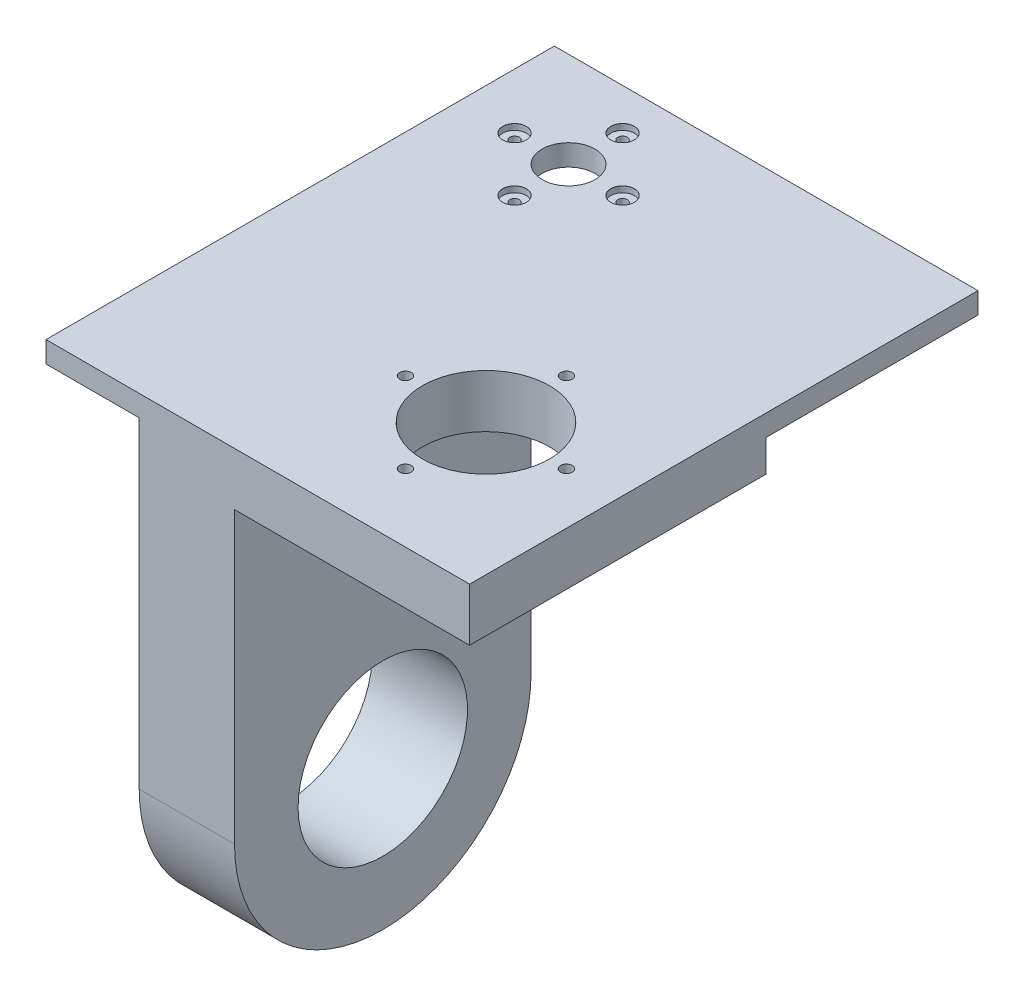
ISO-10303-21;
HEADER;
FILE_DESCRIPTION(('STEP AP214'),'2;1');
FILE_NAME('part.step','',(''),(''),'','','');
FILE_SCHEMA(('AUTOMOTIVE_DESIGN { 1 0 10303 214 1 1 1 1 }'));
ENDSEC;
DATA;
#1=APPLICATION_CONTEXT('core data for automotive mechanical design processes');
#2=APPLICATION_PROTOCOL_DEFINITION('international standard','automotive_design',2000,#1);
#3=PRODUCT_CONTEXT('',#1,'mechanical');
#4=PRODUCT('Part','Part','',(#3));
#5=PRODUCT_RELATED_PRODUCT_CATEGORY('part','',(#4));
#6=PRODUCT_DEFINITION_FORMATION('','',#4);
#7=PRODUCT_DEFINITION_CONTEXT('part definition',#1,'design');
#8=PRODUCT_DEFINITION('design','',#6,#7);
#9=PRODUCT_DEFINITION_SHAPE('','',#8);
#10=(LENGTH_UNIT() NAMED_UNIT(*) SI_UNIT(.MILLI.,.METRE.));
#11=(NAMED_UNIT(*) PLANE_ANGLE_UNIT() SI_UNIT($,.RADIAN.));
#12=(NAMED_UNIT(*) SI_UNIT($,.STERADIAN.) SOLID_ANGLE_UNIT());
#13=UNCERTAINTY_MEASURE_WITH_UNIT(LENGTH_MEASURE(1.E-05),#10,'distance_accuracy_value','');
#14=(GEOMETRIC_REPRESENTATION_CONTEXT(3) GLOBAL_UNCERTAINTY_ASSIGNED_CONTEXT((#13)) GLOBAL_UNIT_ASSIGNED_CONTEXT((#10,
#11,#12)) REPRESENTATION_CONTEXT('',''));
#15=CARTESIAN_POINT('',(0.,0.,0.));
#16=DIRECTION('',(0.,0.,1.));
#17=DIRECTION('',(1.,0.,0.));
#18=AXIS2_PLACEMENT_3D('',#15,#16,#17);
#19=CARTESIAN_POINT('',(0.,0.,0.));
#20=DIRECTION('',(1.,0.,0.));
#21=DIRECTION('',(0.,0.,-1.));
#22=AXIS2_PLACEMENT_3D('',#19,#20,#21);
#23=PLANE('',#22);
#24=CARTESIAN_POINT('',(0.,0.,0.));
#25=DIRECTION('',(1.,0.,0.));
#26=DIRECTION('',(0.,0.,-1.));
#27=AXIS2_PLACEMENT_3D('',#24,#25,#26);
#28=CIRCLE('',#27,40.);
#29=CARTESIAN_POINT('',(0.,0.,40.));
#30=VERTEX_POINT('',#29);
#31=EDGE_CURVE('E170',#30,#30,#28,.T.);
#32=ORIENTED_EDGE('',*,*,#31,.T.);
#33=EDGE_LOOP('',(#32));
#34=FACE_BOUND('',#33,.T.);
#35=DIRECTION('',(0.,0.,1.));
#36=VECTOR('',#35,1.);
#37=CARTESIAN_POINT('',(0.,151.8,0.));
#38=LINE('',#37,#36);
#39=CARTESIAN_POINT('',(0.,151.8,-70.));
#40=VERTEX_POINT('',#39);
#41=CARTESIAN_POINT('',(0.,151.8,70.));
#42=VERTEX_POINT('',#41);
#43=EDGE_CURVE('E52',#40,#42,#38,.T.);
#44=ORIENTED_EDGE('',*,*,#43,.F.);
#45=DIRECTION('',(0.,1.,0.));
#46=VECTOR('',#45,1.);
#47=CARTESIAN_POINT('',(0.,136.8,-70.));
#48=LINE('',#47,#46);
#49=CARTESIAN_POINT('',(0.,0.,-70.));
#50=VERTEX_POINT('',#49);
#51=EDGE_CURVE('E190',#50,#40,#48,.T.);
#52=ORIENTED_EDGE('',*,*,#51,.F.);
#53=CARTESIAN_POINT('',(0.,0.,0.));
#54=DIRECTION('',(1.,0.,0.));
#55=DIRECTION('',(0.,0.,-1.));
#56=AXIS2_PLACEMENT_3D('',#53,#54,#55);
#57=CIRCLE('',#56,70.);
#58=CARTESIAN_POINT('',(0.,0.,70.));
#59=VERTEX_POINT('',#58);
#60=EDGE_CURVE('E174',#59,#50,#57,.T.);
#61=ORIENTED_EDGE('',*,*,#60,.F.);
#62=DIRECTION('',(0.,-1.,0.));
#63=VECTOR('',#62,1.);
#64=CARTESIAN_POINT('',(0.,0.,70.));
#65=LINE('',#64,#63);
#66=EDGE_CURVE('E57',#42,#59,#65,.T.);
#67=ORIENTED_EDGE('',*,*,#66,.F.);
#68=EDGE_LOOP('',(#44,#52,#61,#67));
#69=FACE_BOUND('',#68,.T.);
#70=ADVANCED_FACE('F35',(#34,#69),#23,.F.);
#71=CARTESIAN_POINT('',(45.,136.8,-70.));
#72=DIRECTION('',(0.,0.,1.));
#73=DIRECTION('',(1.,0.,0.));
#74=AXIS2_PLACEMENT_3D('',#71,#72,#73);
#75=PLANE('',#74);
#76=DIRECTION('',(-1.,0.,0.));
#77=VECTOR('',#76,1.);
#78=CARTESIAN_POINT('',(0.,151.8,-70.));
#79=LINE('',#78,#77);
#80=CARTESIAN_POINT('',(156.,151.8,-70.));
#81=VERTEX_POINT('',#80);
#82=EDGE_CURVE('E117',#81,#40,#79,.T.);
#83=ORIENTED_EDGE('',*,*,#82,.F.);
#84=DIRECTION('',(0.,-1.,0.));
#85=VECTOR('',#84,1.);
#86=CARTESIAN_POINT('',(156.,161.8,-70.));
#87=LINE('',#86,#85);
#88=CARTESIAN_POINT('',(156.,136.8,-70.));
#89=VERTEX_POINT('',#88);
#90=EDGE_CURVE('E123',#81,#89,#87,.T.);
#91=ORIENTED_EDGE('',*,*,#90,.T.);
#92=DIRECTION('',(-1.,0.,0.));
#93=VECTOR('',#92,1.);
#94=CARTESIAN_POINT('',(0.,136.8,-70.));
#95=LINE('',#94,#93);
#96=CARTESIAN_POINT('',(45.,136.8,-70.));
#97=VERTEX_POINT('',#96);
#98=EDGE_CURVE('E159',#89,#97,#95,.T.);
#99=ORIENTED_EDGE('',*,*,#98,.T.);
#100=DIRECTION('',(0.,1.,0.));
#101=VECTOR('',#100,1.);
#102=CARTESIAN_POINT('',(45.,136.8,-70.));
#103=LINE('',#102,#101);
#104=CARTESIAN_POINT('',(45.,0.,-70.));
#105=VERTEX_POINT('',#104);
#106=EDGE_CURVE('E180',#105,#97,#103,.T.);
#107=ORIENTED_EDGE('',*,*,#106,.F.);
#108=DIRECTION('',(-1.,0.,0.));
#109=VECTOR('',#108,1.);
#110=CARTESIAN_POINT('',(45.,0.,-70.));
#111=LINE('',#110,#109);
#112=EDGE_CURVE('E11',#105,#50,#111,.T.);
#113=ORIENTED_EDGE('',*,*,#112,.T.);
#114=ORIENTED_EDGE('',*,*,#51,.T.);
#115=EDGE_LOOP('',(#83,#91,#99,#107,#113,#114));
#116=FACE_BOUND('',#115,.T.);
#117=ADVANCED_FACE('F274',(#116),#75,.F.);
#118=CARTESIAN_POINT('',(45.,0.,0.));
#119=DIRECTION('',(1.,0.,0.));
#120=DIRECTION('',(0.,0.,-1.));
#121=AXIS2_PLACEMENT_3D('',#118,#119,#120);
#122=PLANE('',#121);
#123=CARTESIAN_POINT('',(45.,0.,0.));
#124=DIRECTION('',(1.,0.,0.));
#125=DIRECTION('',(0.,0.,-1.));
#126=AXIS2_PLACEMENT_3D('',#123,#124,#125);
#127=CIRCLE('',#126,70.);
#128=CARTESIAN_POINT('',(45.,0.,70.));
#129=VERTEX_POINT('',#128);
#130=EDGE_CURVE('E177',#129,#105,#127,.T.);
#131=ORIENTED_EDGE('',*,*,#130,.T.);
#132=ORIENTED_EDGE('',*,*,#106,.T.);
#133=DIRECTION('',(0.,0.,1.));
#134=VECTOR('',#133,1.);
#135=CARTESIAN_POINT('',(45.,136.8,70.));
#136=LINE('',#135,#134);
#137=CARTESIAN_POINT('',(45.,136.8,70.));
#138=VERTEX_POINT('',#137);
#139=EDGE_CURVE('E183',#97,#138,#136,.T.);
#140=ORIENTED_EDGE('',*,*,#139,.T.);
#141=DIRECTION('',(0.,-1.,0.));
#142=VECTOR('',#141,1.);
#143=CARTESIAN_POINT('',(45.,0.,70.));
#144=LINE('',#143,#142);
#145=EDGE_CURVE('E186',#138,#129,#144,.T.);
#146=ORIENTED_EDGE('',*,*,#145,.T.);
#147=EDGE_LOOP('',(#131,#132,#140,#146));
#148=FACE_BOUND('',#147,.T.);
#149=CARTESIAN_POINT('',(45.,0.,0.));
#150=DIRECTION('',(1.,0.,0.));
#151=DIRECTION('',(0.,0.,-1.));
#152=AXIS2_PLACEMENT_3D('',#149,#150,#151);
#153=CIRCLE('',#152,40.);
#154=CARTESIAN_POINT('',(45.,0.,40.));
#155=VERTEX_POINT('',#154);
#156=EDGE_CURVE('E171',#155,#155,#153,.T.);
#157=ORIENTED_EDGE('',*,*,#156,.F.);
#158=EDGE_LOOP('',(#157));
#159=FACE_BOUND('',#158,.T.);
#160=ADVANCED_FACE('F281',(#148,#159),#122,.T.);
#161=CARTESIAN_POINT('',(45.,0.,0.));
#162=DIRECTION('',(-1.,0.,0.));
#163=DIRECTION('',(0.,0.,1.));
#164=AXIS2_PLACEMENT_3D('',#161,#162,#163);
#165=CYLINDRICAL_SURFACE('',#164,70.);
#166=ORIENTED_EDGE('',*,*,#60,.T.);
#167=ORIENTED_EDGE('',*,*,#112,.F.);
#168=ORIENTED_EDGE('',*,*,#130,.F.);
#169=DIRECTION('',(-1.,0.,0.));
#170=VECTOR('',#169,1.);
#171=CARTESIAN_POINT('',(45.,0.,70.));
#172=LINE('',#171,#170);
#173=EDGE_CURVE('E44',#129,#59,#172,.T.);
#174=ORIENTED_EDGE('',*,*,#173,.T.);
#175=EDGE_LOOP('',(#166,#167,#168,#174));
#176=FACE_BOUND('',#175,.T.);
#177=ADVANCED_FACE('F37',(#176),#165,.T.);
#178=CARTESIAN_POINT('',(45.,0.,70.));
#179=DIRECTION('',(0.,0.,-1.));
#180=DIRECTION('',(-1.,0.,0.));
#181=AXIS2_PLACEMENT_3D('',#178,#179,#180);
#182=PLANE('',#181);
#183=DIRECTION('',(1.,0.,0.));
#184=VECTOR('',#183,1.);
#185=CARTESIAN_POINT('',(0.,161.8,70.));
#186=LINE('',#185,#184);
#187=CARTESIAN_POINT('',(-44.,161.8,70.));
#188=VERTEX_POINT('',#187);
#189=CARTESIAN_POINT('',(156.,161.8,70.));
#190=VERTEX_POINT('',#189);
#191=EDGE_CURVE('E156',#188,#190,#186,.T.);
#192=ORIENTED_EDGE('',*,*,#191,.F.);
#193=DIRECTION('',(0.,1.,0.));
#194=VECTOR('',#193,1.);
#195=CARTESIAN_POINT('',(-44.,151.8,70.));
#196=LINE('',#195,#194);
#197=CARTESIAN_POINT('',(-44.,151.8,70.));
#198=VERTEX_POINT('',#197);
#199=EDGE_CURVE('E145',#198,#188,#196,.T.);
#200=ORIENTED_EDGE('',*,*,#199,.F.);
#201=DIRECTION('',(-1.,0.,0.));
#202=VECTOR('',#201,1.);
#203=CARTESIAN_POINT('',(0.,151.8,70.));
#204=LINE('',#203,#202);
#205=EDGE_CURVE('E134',#42,#198,#204,.T.);
#206=ORIENTED_EDGE('',*,*,#205,.F.);
#207=ORIENTED_EDGE('',*,*,#66,.T.);
#208=ORIENTED_EDGE('',*,*,#173,.F.);
#209=ORIENTED_EDGE('',*,*,#145,.F.);
#210=DIRECTION('',(1.,0.,0.));
#211=VECTOR('',#210,1.);
#212=CARTESIAN_POINT('',(0.,136.8,70.));
#213=LINE('',#212,#211);
#214=CARTESIAN_POINT('',(156.,136.8,70.));
#215=VERTEX_POINT('',#214);
#216=EDGE_CURVE('E153',#138,#215,#213,.T.);
#217=ORIENTED_EDGE('',*,*,#216,.T.);
#218=DIRECTION('',(0.,-1.,0.));
#219=VECTOR('',#218,1.);
#220=CARTESIAN_POINT('',(156.,161.8,70.));
#221=LINE('',#220,#219);
#222=EDGE_CURVE('E167',#190,#215,#221,.T.);
#223=ORIENTED_EDGE('',*,*,#222,.F.);
#224=EDGE_LOOP('',(#192,#200,#206,#207,#208,#209,#217,#223));
#225=FACE_BOUND('',#224,.T.);
#226=ADVANCED_FACE('F286',(#225),#182,.F.);
#227=CARTESIAN_POINT('',(45.,0.,0.));
#228=DIRECTION('',(-1.,0.,0.));
#229=DIRECTION('',(0.,0.,1.));
#230=AXIS2_PLACEMENT_3D('',#227,#228,#229);
#231=CYLINDRICAL_SURFACE('',#230,40.);
#232=CARTESIAN_POINT('',(45.,0.,40.));
#233=CARTESIAN_POINT('',(44.53125,0.,40.));
#234=CARTESIAN_POINT('',(44.0625,0.,40.));
#235=CARTESIAN_POINT('',(43.125,0.,40.));
#236=CARTESIAN_POINT('',(42.65625,0.,40.));
#237=CARTESIAN_POINT('',(41.71875,0.,40.));
#238=CARTESIAN_POINT('',(41.25,0.,40.));
#239=CARTESIAN_POINT('',(40.3125,0.,40.));
#240=CARTESIAN_POINT('',(39.84375,0.,40.));
#241=CARTESIAN_POINT('',(38.90625,0.,40.));
#242=CARTESIAN_POINT('',(38.4375,0.,40.));
#243=CARTESIAN_POINT('',(37.5,0.,40.));
#244=CARTESIAN_POINT('',(37.03125,0.,40.));
#245=CARTESIAN_POINT('',(36.09375,0.,40.));
#246=CARTESIAN_POINT('',(35.625,0.,40.));
#247=CARTESIAN_POINT('',(34.6875,0.,40.));
#248=CARTESIAN_POINT('',(34.21875,0.,40.));
#249=CARTESIAN_POINT('',(33.28125,0.,40.));
#250=CARTESIAN_POINT('',(32.8125,0.,40.));
#251=CARTESIAN_POINT('',(31.875,0.,40.));
#252=CARTESIAN_POINT('',(31.40625,0.,40.));
#253=CARTESIAN_POINT('',(30.46875,0.,40.));
#254=CARTESIAN_POINT('',(30.,0.,40.));
#255=CARTESIAN_POINT('',(29.0625,0.,40.));
#256=CARTESIAN_POINT('',(28.59375,0.,40.));
#257=CARTESIAN_POINT('',(27.65625,0.,40.));
#258=CARTESIAN_POINT('',(27.1875,0.,40.));
#259=CARTESIAN_POINT('',(26.25,0.,40.));
#260=CARTESIAN_POINT('',(25.78125,0.,40.));
#261=CARTESIAN_POINT('',(24.84375,0.,40.));
#262=CARTESIAN_POINT('',(24.375,0.,40.));
#263=CARTESIAN_POINT('',(23.4375,0.,40.));
#264=CARTESIAN_POINT('',(22.96875,0.,40.));
#265=CARTESIAN_POINT('',(22.03125,0.,40.));
#266=CARTESIAN_POINT('',(21.5625,0.,40.));
#267=CARTESIAN_POINT('',(20.625,0.,40.));
#268=CARTESIAN_POINT('',(20.15625,0.,40.));
#269=CARTESIAN_POINT('',(19.21875,0.,40.));
#270=CARTESIAN_POINT('',(18.75,0.,40.));
#271=CARTESIAN_POINT('',(17.8125,0.,40.));
#272=CARTESIAN_POINT('',(17.34375,0.,40.));
#273=CARTESIAN_POINT('',(16.40625,0.,40.));
#274=CARTESIAN_POINT('',(15.9375,0.,40.));
#275=CARTESIAN_POINT('',(15.,0.,40.));
#276=CARTESIAN_POINT('',(14.53125,0.,40.));
#277=CARTESIAN_POINT('',(13.59375,0.,40.));
#278=CARTESIAN_POINT('',(13.125,0.,40.));
#279=CARTESIAN_POINT('',(12.1875,0.,40.));
#280=CARTESIAN_POINT('',(11.71875,0.,40.));
#281=CARTESIAN_POINT('',(10.78125,0.,40.));
#282=CARTESIAN_POINT('',(10.3125,0.,40.));
#283=CARTESIAN_POINT('',(9.375,0.,40.));
#284=CARTESIAN_POINT('',(8.90625,0.,40.));
#285=CARTESIAN_POINT('',(7.96874999999999,0.,40.));
#286=CARTESIAN_POINT('',(7.5,0.,40.));
#287=CARTESIAN_POINT('',(6.5625,0.,40.));
#288=CARTESIAN_POINT('',(6.09375,0.,40.));
#289=CARTESIAN_POINT('',(5.15625,0.,40.));
#290=CARTESIAN_POINT('',(4.68749999999999,0.,40.));
#291=CARTESIAN_POINT('',(3.74999999999999,0.,40.));
#292=CARTESIAN_POINT('',(3.28124999999999,0.,40.));
#293=CARTESIAN_POINT('',(2.34374999999999,0.,40.));
#294=CARTESIAN_POINT('',(1.87499999999999,0.,40.));
#295=CARTESIAN_POINT('',(0.937499999999992,0.,40.));
#296=CARTESIAN_POINT('',(0.468749999999993,0.,40.));
#297=CARTESIAN_POINT('',(0.,0.,40.));
#298=B_SPLINE_CURVE_WITH_KNOTS('',3,(#232,#233,#234,#235,#236,#237,#238,#239,#240,#241,#242,
#243,#244,#245,#246,#247,#248,#249,#250,#251,#252,#253,#254,#255,#256,#257,#258,#259,#260,#261,
#262,#263,#264,#265,#266,#267,#268,#269,#270,#271,#272,#273,#274,#275,#276,#277,#278,#279,#280,
#281,#282,#283,#284,#285,#286,#287,#288,#289,#290,#291,#292,#293,#294,#295,#296,#297),
.UNSPECIFIED.,.F.,.F.,(4,2,2,2,2,2,2,2,2,2,2,2,2,2,2,2,2,2,2,2,2,2,2,2,2,2,2,2,2,2,2,2,4),(0.,
1.40625,2.8125,4.21875000000001,5.62500000000001,7.03125,8.4375,9.84375000000001,11.25,12.65625,
14.0625,15.46875,16.875,18.28125,19.6875,21.09375,22.5,23.90625,25.3125,26.71875,28.125,
29.53125,30.9375,32.34375,33.75,35.15625,36.5625,37.96875,39.375,40.78125,42.1875,43.59375,45.),.UNSPECIFIED.);
#299=EDGE_CURVE('BSEAM250',#155,#30,#298,.T.);
#300=ORIENTED_EDGE('',*,*,#156,.T.);
#301=ORIENTED_EDGE('',*,*,#31,.F.);
#302=ORIENTED_EDGE('',*,*,#299,.T.);
#303=ORIENTED_EDGE('',*,*,#299,.F.);
#304=EDGE_LOOP('',(#300,#302,#301,#303));
#305=FACE_BOUND('',#304,.T.);
#306=ADVANCED_FACE('F250',(#305),#231,.F.);
#307=CARTESIAN_POINT('',(0.,161.8,0.));
#308=DIRECTION('',(0.,1.,0.));
#309=DIRECTION('',(0.,0.,1.));
#310=AXIS2_PLACEMENT_3D('',#307,#308,#309);
#311=PLANE('',#310);
#312=CARTESIAN_POINT('',(93.7,161.8,-38.));
#313=DIRECTION('',(0.,1.,0.));
#314=DIRECTION('',(0.,0.,1.));
#315=AXIS2_PLACEMENT_3D('',#312,#313,#314);
#316=CIRCLE('',#315,2.74999999999999);
#317=CARTESIAN_POINT('',(93.7,161.8,-35.25));
#318=VERTEX_POINT('',#317);
#319=EDGE_CURVE('E396',#318,#318,#316,.T.);
#320=ORIENTED_EDGE('',*,*,#319,.F.);
#321=EDGE_LOOP('',(#320));
#322=FACE_BOUND('',#321,.T.);
#323=CARTESIAN_POINT('',(93.7,161.8,38.));
#324=DIRECTION('',(0.,1.,0.));
#325=DIRECTION('',(0.,0.,1.));
#326=AXIS2_PLACEMENT_3D('',#323,#324,#325);
#327=CIRCLE('',#326,2.74999999999999);
#328=CARTESIAN_POINT('',(93.7,161.8,40.75));
#329=VERTEX_POINT('',#328);
#330=EDGE_CURVE('E399',#329,#329,#327,.T.);
#331=ORIENTED_EDGE('',*,*,#330,.F.);
#332=EDGE_LOOP('',(#331));
#333=FACE_BOUND('',#332,.T.);
#334=CARTESIAN_POINT('',(55.7,161.8,0.));
#335=DIRECTION('',(0.,1.,0.));
#336=DIRECTION('',(0.,0.,1.));
#337=AXIS2_PLACEMENT_3D('',#334,#335,#336);
#338=CIRCLE('',#337,2.74999999999999);
#339=CARTESIAN_POINT('',(55.7,161.8,2.74999999999999));
#340=VERTEX_POINT('',#339);
#341=EDGE_CURVE('E408',#340,#340,#338,.T.);
#342=ORIENTED_EDGE('',*,*,#341,.F.);
#343=EDGE_LOOP('',(#342));
#344=FACE_BOUND('',#343,.T.);
#345=CARTESIAN_POINT('',(131.7,161.8,0.));
#346=DIRECTION('',(0.,1.,0.));
#347=DIRECTION('',(0.,0.,1.));
#348=AXIS2_PLACEMENT_3D('',#345,#346,#347);
#349=CIRCLE('',#348,2.74999999999997);
#350=CARTESIAN_POINT('',(131.7,161.8,2.74999999999997));
#351=VERTEX_POINT('',#350);
#352=EDGE_CURVE('E414',#351,#351,#349,.T.);
#353=ORIENTED_EDGE('',*,*,#352,.F.);
#354=EDGE_LOOP('',(#353));
#355=FACE_BOUND('',#354,.T.);
#356=CARTESIAN_POINT('',(7.69999999999997,161.8,-150.5));
#357=DIRECTION('',(0.,1.,0.));
#358=DIRECTION('',(0.,0.,1.));
#359=AXIS2_PLACEMENT_3D('',#356,#357,#358);
#360=CIRCLE('',#359,5.5665);
#361=CARTESIAN_POINT('',(7.69999999999997,161.8,-144.9335));
#362=VERTEX_POINT('',#361);
#363=EDGE_CURVE('E420',#362,#362,#360,.T.);
#364=ORIENTED_EDGE('',*,*,#363,.F.);
#365=EDGE_LOOP('',(#364));
#366=FACE_BOUND('',#365,.T.);
#367=CARTESIAN_POINT('',(-17.8,161.8,-125.));
#368=DIRECTION('',(0.,1.,0.));
#369=DIRECTION('',(0.,0.,1.));
#370=AXIS2_PLACEMENT_3D('',#367,#368,#369);
#371=CIRCLE('',#370,5.5665);
#372=CARTESIAN_POINT('',(-17.8,161.8,-119.4335));
#373=VERTEX_POINT('',#372);
#374=EDGE_CURVE('E432',#373,#373,#371,.T.);
#375=ORIENTED_EDGE('',*,*,#374,.F.);
#376=EDGE_LOOP('',(#375));
#377=FACE_BOUND('',#376,.T.);
#378=CARTESIAN_POINT('',(7.69999999999997,161.8,-99.5));
#379=DIRECTION('',(0.,1.,0.));
#380=DIRECTION('',(0.,0.,1.));
#381=AXIS2_PLACEMENT_3D('',#378,#379,#380);
#382=CIRCLE('',#381,5.5665);
#383=CARTESIAN_POINT('',(7.69999999999997,161.8,-93.9335));
#384=VERTEX_POINT('',#383);
#385=EDGE_CURVE('E206',#384,#384,#382,.T.);
#386=ORIENTED_EDGE('',*,*,#385,.F.);
#387=EDGE_LOOP('',(#386));
#388=FACE_BOUND('',#387,.T.);
#389=CARTESIAN_POINT('',(33.2,161.8,-125.));
#390=DIRECTION('',(0.,1.,0.));
#391=DIRECTION('',(0.,0.,1.));
#392=AXIS2_PLACEMENT_3D('',#389,#390,#391);
#393=CIRCLE('',#392,5.5665);
#394=CARTESIAN_POINT('',(33.2,161.8,-119.4335));
#395=VERTEX_POINT('',#394);
#396=EDGE_CURVE('E202',#395,#395,#393,.T.);
#397=ORIENTED_EDGE('',*,*,#396,.F.);
#398=EDGE_LOOP('',(#397));
#399=FACE_BOUND('',#398,.T.);
#400=CARTESIAN_POINT('',(7.69999999999997,161.8,-125.));
#401=DIRECTION('',(0.,1.,0.));
#402=DIRECTION('',(0.,0.,1.));
#403=AXIS2_PLACEMENT_3D('',#400,#401,#402);
#404=CIRCLE('',#403,12.5);
#405=CARTESIAN_POINT('',(7.69999999999997,161.8,-112.5));
#406=VERTEX_POINT('',#405);
#407=EDGE_CURVE('E198',#406,#406,#404,.T.);
#408=ORIENTED_EDGE('',*,*,#407,.F.);
#409=EDGE_LOOP('',(#408));
#410=FACE_BOUND('',#409,.T.);
#411=DIRECTION('',(0.,0.,-1.));
#412=VECTOR('',#411,1.);
#413=CARTESIAN_POINT('',(156.,161.8,-70.));
#414=LINE('',#413,#412);
#415=CARTESIAN_POINT('',(156.,161.8,-170.));
#416=VERTEX_POINT('',#415);
#417=EDGE_CURVE('E158',#190,#416,#414,.T.);
#418=ORIENTED_EDGE('',*,*,#417,.T.);
#419=DIRECTION('',(-1.,0.,0.));
#420=VECTOR('',#419,1.);
#421=CARTESIAN_POINT('',(0.,161.8,-170.));
#422=LINE('',#421,#420);
#423=CARTESIAN_POINT('',(-44.,161.8,-170.));
#424=VERTEX_POINT('',#423);
#425=EDGE_CURVE('E113',#416,#424,#422,.T.);
#426=ORIENTED_EDGE('',*,*,#425,.T.);
#427=DIRECTION('',(0.,0.,-1.));
#428=VECTOR('',#427,1.);
#429=CARTESIAN_POINT('',(-44.,161.8,0.));
#430=LINE('',#429,#428);
#431=EDGE_CURVE('E127',#188,#424,#430,.T.);
#432=ORIENTED_EDGE('',*,*,#431,.F.);
#433=ORIENTED_EDGE('',*,*,#191,.T.);
#434=EDGE_LOOP('',(#418,#426,#432,#433));
#435=FACE_BOUND('',#434,.T.);
#436=CARTESIAN_POINT('',(93.7,161.8,-4.69651297754447E-13));
#437=DIRECTION('',(0.,1.,0.));
#438=DIRECTION('',(0.,0.,1.));
#439=AXIS2_PLACEMENT_3D('',#436,#437,#438);
#440=CIRCLE('',#439,30.);
#441=CARTESIAN_POINT('',(93.7,161.8,29.9999999999995));
#442=VERTEX_POINT('',#441);
#443=EDGE_CURVE('E150',#442,#442,#440,.T.);
#444=ORIENTED_EDGE('',*,*,#443,.F.);
#445=EDGE_LOOP('',(#444));
#446=FACE_BOUND('',#445,.T.);
#447=ADVANCED_FACE('F246',(#322,#333,#344,#355,#366,#377,#388,#399,#410,#435,#446),#311,.T.);
#448=CARTESIAN_POINT('',(0.,136.8,0.));
#449=DIRECTION('',(0.,1.,0.));
#450=DIRECTION('',(0.,0.,1.));
#451=AXIS2_PLACEMENT_3D('',#448,#449,#450);
#452=PLANE('',#451);
#453=CARTESIAN_POINT('',(93.7,136.8,-38.));
#454=DIRECTION('',(0.,1.,0.));
#455=DIRECTION('',(0.,0.,1.));
#456=AXIS2_PLACEMENT_3D('',#453,#454,#455);
#457=CIRCLE('',#456,2.74999999999998);
#458=CARTESIAN_POINT('',(93.7,136.8,-35.25));
#459=VERTEX_POINT('',#458);
#460=EDGE_CURVE('E398',#459,#459,#457,.T.);
#461=ORIENTED_EDGE('',*,*,#460,.T.);
#462=EDGE_LOOP('',(#461));
#463=FACE_BOUND('',#462,.T.);
#464=CARTESIAN_POINT('',(93.7,136.8,38.));
#465=DIRECTION('',(0.,1.,0.));
#466=DIRECTION('',(0.,0.,1.));
#467=AXIS2_PLACEMENT_3D('',#464,#465,#466);
#468=CIRCLE('',#467,2.74999999999998);
#469=CARTESIAN_POINT('',(93.7,136.8,40.75));
#470=VERTEX_POINT('',#469);
#471=EDGE_CURVE('E402',#470,#470,#468,.T.);
#472=ORIENTED_EDGE('',*,*,#471,.T.);
#473=EDGE_LOOP('',(#472));
#474=FACE_BOUND('',#473,.T.);
#475=CARTESIAN_POINT('',(55.7,136.8,0.));
#476=DIRECTION('',(0.,1.,0.));
#477=DIRECTION('',(0.,0.,1.));
#478=AXIS2_PLACEMENT_3D('',#475,#476,#477);
#479=CIRCLE('',#478,2.74999999999998);
#480=CARTESIAN_POINT('',(55.7,136.8,2.74999999999998));
#481=VERTEX_POINT('',#480);
#482=EDGE_CURVE('E411',#481,#481,#479,.T.);
#483=ORIENTED_EDGE('',*,*,#482,.T.);
#484=EDGE_LOOP('',(#483));
#485=FACE_BOUND('',#484,.T.);
#486=CARTESIAN_POINT('',(131.7,136.8,0.));
#487=DIRECTION('',(0.,1.,0.));
#488=DIRECTION('',(0.,0.,1.));
#489=AXIS2_PLACEMENT_3D('',#486,#487,#488);
#490=CIRCLE('',#489,2.74999999999997);
#491=CARTESIAN_POINT('',(131.7,136.8,2.74999999999997));
#492=VERTEX_POINT('',#491);
#493=EDGE_CURVE('E417',#492,#492,#490,.T.);
#494=ORIENTED_EDGE('',*,*,#493,.T.);
#495=EDGE_LOOP('',(#494));
#496=FACE_BOUND('',#495,.T.);
#497=ORIENTED_EDGE('',*,*,#139,.F.);
#498=ORIENTED_EDGE('',*,*,#98,.F.);
#499=DIRECTION('',(0.,0.,-1.));
#500=VECTOR('',#499,1.);
#501=CARTESIAN_POINT('',(156.,136.8,-70.));
#502=LINE('',#501,#500);
#503=EDGE_CURVE('E162',#215,#89,#502,.T.);
#504=ORIENTED_EDGE('',*,*,#503,.F.);
#505=ORIENTED_EDGE('',*,*,#216,.F.);
#506=EDGE_LOOP('',(#497,#498,#504,#505));
#507=FACE_BOUND('',#506,.T.);
#508=CARTESIAN_POINT('',(93.7,136.8,-4.69651297754447E-13));
#509=DIRECTION('',(0.,1.,0.));
#510=DIRECTION('',(0.,0.,1.));
#511=AXIS2_PLACEMENT_3D('',#508,#509,#510);
#512=CIRCLE('',#511,30.);
#513=CARTESIAN_POINT('',(93.7,136.8,29.9999999999995));
#514=VERTEX_POINT('',#513);
#515=EDGE_CURVE('E148',#514,#514,#512,.T.);
#516=ORIENTED_EDGE('',*,*,#515,.T.);
#517=EDGE_LOOP('',(#516));
#518=FACE_BOUND('',#517,.T.);
#519=ADVANCED_FACE('F249',(#463,#474,#485,#496,#507,#518),#452,.F.);
#520=CARTESIAN_POINT('',(156.,161.8,-70.));
#521=DIRECTION('',(-1.,0.,0.));
#522=DIRECTION('',(0.,0.,1.));
#523=AXIS2_PLACEMENT_3D('',#520,#521,#522);
#524=PLANE('',#523);
#525=ORIENTED_EDGE('',*,*,#503,.T.);
#526=ORIENTED_EDGE('',*,*,#90,.F.);
#527=DIRECTION('',(0.,0.,1.));
#528=VECTOR('',#527,1.);
#529=CARTESIAN_POINT('',(156.,151.8,0.));
#530=LINE('',#529,#528);
#531=CARTESIAN_POINT('',(156.,151.8,-170.));
#532=VERTEX_POINT('',#531);
#533=EDGE_CURVE('E120',#532,#81,#530,.T.);
#534=ORIENTED_EDGE('',*,*,#533,.F.);
#535=DIRECTION('',(0.,1.,0.));
#536=VECTOR('',#535,1.);
#537=CARTESIAN_POINT('',(156.,151.8,-170.));
#538=LINE('',#537,#536);
#539=EDGE_CURVE('E107',#532,#416,#538,.T.);
#540=ORIENTED_EDGE('',*,*,#539,.T.);
#541=ORIENTED_EDGE('',*,*,#417,.F.);
#542=ORIENTED_EDGE('',*,*,#222,.T.);
#543=EDGE_LOOP('',(#525,#526,#534,#540,#541,#542));
#544=FACE_BOUND('',#543,.T.);
#545=ADVANCED_FACE('F122',(#544),#524,.F.);
#546=CARTESIAN_POINT('',(93.7,161.8,-4.69651297754447E-13));
#547=DIRECTION('',(0.,-1.,0.));
#548=DIRECTION('',(0.,0.,-1.));
#549=AXIS2_PLACEMENT_3D('',#546,#547,#548);
#550=CYLINDRICAL_SURFACE('',#549,30.);
#551=ORIENTED_EDGE('',*,*,#443,.T.);
#552=EDGE_LOOP('',(#551));
#553=FACE_BOUND('',#552,.T.);
#554=ORIENTED_EDGE('',*,*,#515,.F.);
#555=EDGE_LOOP('',(#554));
#556=FACE_BOUND('',#555,.T.);
#557=ADVANCED_FACE('F256',(#553,#556),#550,.F.);
#558=CARTESIAN_POINT('',(-44.,151.8,0.));
#559=DIRECTION('',(1.,0.,0.));
#560=DIRECTION('',(0.,0.,-1.));
#561=AXIS2_PLACEMENT_3D('',#558,#559,#560);
#562=PLANE('',#561);
#563=ORIENTED_EDGE('',*,*,#431,.T.);
#564=DIRECTION('',(0.,1.,0.));
#565=VECTOR('',#564,1.);
#566=CARTESIAN_POINT('',(-44.,151.8,-170.));
#567=LINE('',#566,#565);
#568=CARTESIAN_POINT('',(-44.,151.8,-170.));
#569=VERTEX_POINT('',#568);
#570=EDGE_CURVE('E116',#569,#424,#567,.T.);
#571=ORIENTED_EDGE('',*,*,#570,.F.);
#572=DIRECTION('',(0.,0.,-1.));
#573=VECTOR('',#572,1.);
#574=CARTESIAN_POINT('',(-44.,151.8,0.));
#575=LINE('',#574,#573);
#576=EDGE_CURVE('E131',#198,#569,#575,.T.);
#577=ORIENTED_EDGE('',*,*,#576,.F.);
#578=ORIENTED_EDGE('',*,*,#199,.T.);
#579=EDGE_LOOP('',(#563,#571,#577,#578));
#580=FACE_BOUND('',#579,.T.);
#581=ADVANCED_FACE('F259',(#580),#562,.F.);
#582=CARTESIAN_POINT('',(0.,151.8,-170.));
#583=DIRECTION('',(0.,0.,-1.));
#584=DIRECTION('',(-1.,0.,0.));
#585=AXIS2_PLACEMENT_3D('',#582,#583,#584);
#586=PLANE('',#585);
#587=ORIENTED_EDGE('',*,*,#425,.F.);
#588=ORIENTED_EDGE('',*,*,#539,.F.);
#589=DIRECTION('',(-1.,0.,0.));
#590=VECTOR('',#589,1.);
#591=CARTESIAN_POINT('',(0.,151.8,-170.));
#592=LINE('',#591,#590);
#593=EDGE_CURVE('E111',#532,#569,#592,.T.);
#594=ORIENTED_EDGE('',*,*,#593,.T.);
#595=ORIENTED_EDGE('',*,*,#570,.T.);
#596=EDGE_LOOP('',(#587,#588,#594,#595));
#597=FACE_BOUND('',#596,.T.);
#598=ADVANCED_FACE('F109',(#597),#586,.T.);
#599=CARTESIAN_POINT('',(0.,151.8,0.));
#600=DIRECTION('',(0.,1.,0.));
#601=DIRECTION('',(0.,0.,1.));
#602=AXIS2_PLACEMENT_3D('',#599,#600,#601);
#603=PLANE('',#602);
#604=CARTESIAN_POINT('',(7.69999999999997,151.8,-150.5));
#605=DIRECTION('',(0.,1.,0.));
#606=DIRECTION('',(0.,0.,1.));
#607=AXIS2_PLACEMENT_3D('',#604,#605,#606);
#608=CIRCLE('',#607,2.24999999999996);
#609=CARTESIAN_POINT('',(7.69999999999997,151.8,-148.25));
#610=VERTEX_POINT('',#609);
#611=EDGE_CURVE('E39',#610,#610,#608,.T.);
#612=ORIENTED_EDGE('',*,*,#611,.T.);
#613=EDGE_LOOP('',(#612));
#614=FACE_BOUND('',#613,.T.);
#615=CARTESIAN_POINT('',(-17.8,151.8,-125.));
#616=DIRECTION('',(0.,1.,0.));
#617=DIRECTION('',(0.,0.,1.));
#618=AXIS2_PLACEMENT_3D('',#615,#616,#617);
#619=CIRCLE('',#618,2.24999999999996);
#620=CARTESIAN_POINT('',(-17.8,151.8,-122.75));
#621=VERTEX_POINT('',#620);
#622=EDGE_CURVE('E204',#621,#621,#619,.T.);
#623=ORIENTED_EDGE('',*,*,#622,.T.);
#624=EDGE_LOOP('',(#623));
#625=FACE_BOUND('',#624,.T.);
#626=CARTESIAN_POINT('',(7.69999999999997,151.8,-99.5));
#627=DIRECTION('',(0.,1.,0.));
#628=DIRECTION('',(0.,0.,1.));
#629=AXIS2_PLACEMENT_3D('',#626,#627,#628);
#630=CIRCLE('',#629,2.24999999999996);
#631=CARTESIAN_POINT('',(7.69999999999997,151.8,-97.25));
#632=VERTEX_POINT('',#631);
#633=EDGE_CURVE('E200',#632,#632,#630,.T.);
#634=ORIENTED_EDGE('',*,*,#633,.T.);
#635=EDGE_LOOP('',(#634));
#636=FACE_BOUND('',#635,.T.);
#637=CARTESIAN_POINT('',(33.2,151.8,-125.));
#638=DIRECTION('',(0.,1.,0.));
#639=DIRECTION('',(0.,0.,1.));
#640=AXIS2_PLACEMENT_3D('',#637,#638,#639);
#641=CIRCLE('',#640,2.24999999999996);
#642=CARTESIAN_POINT('',(33.2,151.8,-122.75));
#643=VERTEX_POINT('',#642);
#644=EDGE_CURVE('E195',#643,#643,#641,.T.);
#645=ORIENTED_EDGE('',*,*,#644,.T.);
#646=EDGE_LOOP('',(#645));
#647=FACE_BOUND('',#646,.T.);
#648=CARTESIAN_POINT('',(7.69999999999997,151.8,-125.));
#649=DIRECTION('',(0.,1.,0.));
#650=DIRECTION('',(0.,0.,1.));
#651=AXIS2_PLACEMENT_3D('',#648,#649,#650);
#652=CIRCLE('',#651,12.5);
#653=CARTESIAN_POINT('',(7.69999999999997,151.8,-112.5));
#654=VERTEX_POINT('',#653);
#655=EDGE_CURVE('E142',#654,#654,#652,.T.);
#656=ORIENTED_EDGE('',*,*,#655,.T.);
#657=EDGE_LOOP('',(#656));
#658=FACE_BOUND('',#657,.T.);
#659=ORIENTED_EDGE('',*,*,#533,.T.);
#660=ORIENTED_EDGE('',*,*,#82,.T.);
#661=ORIENTED_EDGE('',*,*,#43,.T.);
#662=ORIENTED_EDGE('',*,*,#205,.T.);
#663=ORIENTED_EDGE('',*,*,#576,.T.);
#664=ORIENTED_EDGE('',*,*,#593,.F.);
#665=EDGE_LOOP('',(#659,#660,#661,#662,#663,#664));
#666=FACE_BOUND('',#665,.T.);
#667=ADVANCED_FACE('F129',(#614,#625,#636,#647,#658,#666),#603,.F.);
#668=CARTESIAN_POINT('',(7.69999999999997,151.8,-125.));
#669=DIRECTION('',(0.,1.,0.));
#670=DIRECTION('',(0.,0.,1.));
#671=AXIS2_PLACEMENT_3D('',#668,#669,#670);
#672=CYLINDRICAL_SURFACE('',#671,12.5);
#673=ORIENTED_EDGE('',*,*,#655,.F.);
#674=EDGE_LOOP('',(#673));
#675=FACE_BOUND('',#674,.T.);
#676=ORIENTED_EDGE('',*,*,#407,.T.);
#677=EDGE_LOOP('',(#676));
#678=FACE_BOUND('',#677,.T.);
#679=ADVANCED_FACE('F244',(#675,#678),#672,.F.);
#680=CARTESIAN_POINT('',(33.2,161.8,-125.));
#681=DIRECTION('',(0.,1.,0.));
#682=DIRECTION('',(0.,0.,1.));
#683=AXIS2_PLACEMENT_3D('',#680,#681,#682);
#684=CYLINDRICAL_SURFACE('',#683,2.24999999999996);
#685=CARTESIAN_POINT('',(33.2,159.,-125.));
#686=DIRECTION('',(0.,1.,0.));
#687=DIRECTION('',(0.,0.,1.));
#688=AXIS2_PLACEMENT_3D('',#685,#686,#687);
#689=CIRCLE('',#688,2.25);
#690=CARTESIAN_POINT('',(33.2,159.,-122.75));
#691=VERTEX_POINT('',#690);
#692=EDGE_CURVE('E199',#691,#691,#689,.T.);
#693=ORIENTED_EDGE('',*,*,#692,.T.);
#694=EDGE_LOOP('',(#693));
#695=FACE_BOUND('',#694,.T.);
#696=ORIENTED_EDGE('',*,*,#644,.F.);
#697=EDGE_LOOP('',(#696));
#698=FACE_BOUND('',#697,.T.);
#699=ADVANCED_FACE('F312',(#695,#698),#684,.F.);
#700=CARTESIAN_POINT('',(38.7415,159.,-125.));
#701=DIRECTION('',(0.,-1.,0.));
#702=DIRECTION('',(0.,0.,-1.));
#703=AXIS2_PLACEMENT_3D('',#700,#701,#702);
#704=PLANE('',#703);
#705=ORIENTED_EDGE('',*,*,#692,.F.);
#706=EDGE_LOOP('',(#705));
#707=FACE_BOUND('',#706,.T.);
#708=CARTESIAN_POINT('',(33.2,159.,-125.));
#709=DIRECTION('',(0.,1.,0.));
#710=DIRECTION('',(0.,0.,1.));
#711=AXIS2_PLACEMENT_3D('',#708,#709,#710);
#712=CIRCLE('',#711,5.5415);
#713=CARTESIAN_POINT('',(33.2,159.,-119.4585));
#714=VERTEX_POINT('',#713);
#715=EDGE_CURVE('E235',#714,#714,#712,.T.);
#716=ORIENTED_EDGE('',*,*,#715,.T.);
#717=EDGE_LOOP('',(#716));
#718=FACE_BOUND('',#717,.T.);
#719=ADVANCED_FACE('F316',(#707,#718),#704,.F.);
#720=CARTESIAN_POINT('',(33.2,161.8,-125.));
#721=DIRECTION('',(0.,1.,0.));
#722=DIRECTION('',(0.,0.,1.));
#723=AXIS2_PLACEMENT_3D('',#720,#721,#722);
#724=CYLINDRICAL_SURFACE('',#723,5.5415);
#725=ORIENTED_EDGE('',*,*,#715,.F.);
#726=EDGE_LOOP('',(#725));
#727=FACE_BOUND('',#726,.T.);
#728=CARTESIAN_POINT('',(33.2,161.775,-125.));
#729=DIRECTION('',(0.,1.,0.));
#730=DIRECTION('',(0.,0.,1.));
#731=AXIS2_PLACEMENT_3D('',#728,#729,#730);
#732=CIRCLE('',#731,5.5415);
#733=CARTESIAN_POINT('',(33.2,161.775,-119.4585));
#734=VERTEX_POINT('',#733);
#735=EDGE_CURVE('E232',#734,#734,#732,.T.);
#736=ORIENTED_EDGE('',*,*,#735,.T.);
#737=EDGE_LOOP('',(#736));
#738=FACE_BOUND('',#737,.T.);
#739=ADVANCED_FACE('F320',(#727,#738),#724,.F.);
#740=CARTESIAN_POINT('',(33.2,161.8,-125.));
#741=DIRECTION('',(0.,1.,0.));
#742=DIRECTION('',(0.,0.,1.));
#743=AXIS2_PLACEMENT_3D('',#740,#741,#742);
#744=CONICAL_SURFACE('',#743,5.5665,0.785398163397448);
#745=ORIENTED_EDGE('',*,*,#735,.F.);
#746=EDGE_LOOP('',(#745));
#747=FACE_BOUND('',#746,.T.);
#748=ORIENTED_EDGE('',*,*,#396,.T.);
#749=EDGE_LOOP('',(#748));
#750=FACE_BOUND('',#749,.T.);
#751=ADVANCED_FACE('F324',(#747,#750),#744,.F.);
#752=CARTESIAN_POINT('',(7.69999999999997,161.8,-99.5));
#753=DIRECTION('',(0.,1.,0.));
#754=DIRECTION('',(0.,0.,1.));
#755=AXIS2_PLACEMENT_3D('',#752,#753,#754);
#756=CYLINDRICAL_SURFACE('',#755,2.24999999999996);
#757=CARTESIAN_POINT('',(7.69999999999997,159.,-99.5));
#758=DIRECTION('',(0.,1.,0.));
#759=DIRECTION('',(0.,0.,1.));
#760=AXIS2_PLACEMENT_3D('',#757,#758,#759);
#761=CIRCLE('',#760,2.25);
#762=CARTESIAN_POINT('',(7.69999999999997,159.,-97.25));
#763=VERTEX_POINT('',#762);
#764=EDGE_CURVE('E203',#763,#763,#761,.T.);
#765=ORIENTED_EDGE('',*,*,#764,.T.);
#766=EDGE_LOOP('',(#765));
#767=FACE_BOUND('',#766,.T.);
#768=ORIENTED_EDGE('',*,*,#633,.F.);
#769=EDGE_LOOP('',(#768));
#770=FACE_BOUND('',#769,.T.);
#771=ADVANCED_FACE('F328',(#767,#770),#756,.F.);
#772=CARTESIAN_POINT('',(13.2415,159.,-99.5));
#773=DIRECTION('',(0.,-1.,0.));
#774=DIRECTION('',(0.,0.,-1.));
#775=AXIS2_PLACEMENT_3D('',#772,#773,#774);
#776=PLANE('',#775);
#777=ORIENTED_EDGE('',*,*,#764,.F.);
#778=EDGE_LOOP('',(#777));
#779=FACE_BOUND('',#778,.T.);
#780=CARTESIAN_POINT('',(7.69999999999997,159.,-99.5));
#781=DIRECTION('',(0.,1.,0.));
#782=DIRECTION('',(0.,0.,1.));
#783=AXIS2_PLACEMENT_3D('',#780,#781,#782);
#784=CIRCLE('',#783,5.5415);
#785=CARTESIAN_POINT('',(7.69999999999997,159.,-93.9585));
#786=VERTEX_POINT('',#785);
#787=EDGE_CURVE('E225',#786,#786,#784,.T.);
#788=ORIENTED_EDGE('',*,*,#787,.T.);
#789=EDGE_LOOP('',(#788));
#790=FACE_BOUND('',#789,.T.);
#791=ADVANCED_FACE('F332',(#779,#790),#776,.F.);
#792=CARTESIAN_POINT('',(7.69999999999997,161.8,-99.5));
#793=DIRECTION('',(0.,1.,0.));
#794=DIRECTION('',(0.,0.,1.));
#795=AXIS2_PLACEMENT_3D('',#792,#793,#794);
#796=CYLINDRICAL_SURFACE('',#795,5.5415);
#797=ORIENTED_EDGE('',*,*,#787,.F.);
#798=EDGE_LOOP('',(#797));
#799=FACE_BOUND('',#798,.T.);
#800=CARTESIAN_POINT('',(7.69999999999997,161.775,-99.5));
#801=DIRECTION('',(0.,1.,0.));
#802=DIRECTION('',(0.,0.,1.));
#803=AXIS2_PLACEMENT_3D('',#800,#801,#802);
#804=CIRCLE('',#803,5.5415);
#805=CARTESIAN_POINT('',(7.69999999999997,161.775,-93.9585));
#806=VERTEX_POINT('',#805);
#807=EDGE_CURVE('E211',#806,#806,#804,.T.);
#808=ORIENTED_EDGE('',*,*,#807,.T.);
#809=EDGE_LOOP('',(#808));
#810=FACE_BOUND('',#809,.T.);
#811=ADVANCED_FACE('F336',(#799,#810),#796,.F.);
#812=CARTESIAN_POINT('',(7.69999999999997,161.8,-99.5));
#813=DIRECTION('',(0.,1.,0.));
#814=DIRECTION('',(0.,0.,1.));
#815=AXIS2_PLACEMENT_3D('',#812,#813,#814);
#816=CONICAL_SURFACE('',#815,5.5665,0.785398163397448);
#817=ORIENTED_EDGE('',*,*,#807,.F.);
#818=EDGE_LOOP('',(#817));
#819=FACE_BOUND('',#818,.T.);
#820=ORIENTED_EDGE('',*,*,#385,.T.);
#821=EDGE_LOOP('',(#820));
#822=FACE_BOUND('',#821,.T.);
#823=ADVANCED_FACE('F340',(#819,#822),#816,.F.);
#824=CARTESIAN_POINT('',(-17.8,161.8,-125.));
#825=DIRECTION('',(0.,1.,0.));
#826=DIRECTION('',(0.,0.,1.));
#827=AXIS2_PLACEMENT_3D('',#824,#825,#826);
#828=CYLINDRICAL_SURFACE('',#827,2.24999999999996);
#829=CARTESIAN_POINT('',(-17.8,159.,-125.));
#830=DIRECTION('',(0.,1.,0.));
#831=DIRECTION('',(0.,0.,1.));
#832=AXIS2_PLACEMENT_3D('',#829,#830,#831);
#833=CIRCLE('',#832,2.25);
#834=CARTESIAN_POINT('',(-17.8,159.,-122.75));
#835=VERTEX_POINT('',#834);
#836=EDGE_CURVE('E207',#835,#835,#833,.T.);
#837=ORIENTED_EDGE('',*,*,#836,.T.);
#838=EDGE_LOOP('',(#837));
#839=FACE_BOUND('',#838,.T.);
#840=ORIENTED_EDGE('',*,*,#622,.F.);
#841=EDGE_LOOP('',(#840));
#842=FACE_BOUND('',#841,.T.);
#843=ADVANCED_FACE('F344',(#839,#842),#828,.F.);
#844=CARTESIAN_POINT('',(-12.2585,159.,-125.));
#845=DIRECTION('',(0.,-1.,0.));
#846=DIRECTION('',(0.,0.,-1.));
#847=AXIS2_PLACEMENT_3D('',#844,#845,#846);
#848=PLANE('',#847);
#849=ORIENTED_EDGE('',*,*,#836,.F.);
#850=EDGE_LOOP('',(#849));
#851=FACE_BOUND('',#850,.T.);
#852=CARTESIAN_POINT('',(-17.8,159.,-125.));
#853=DIRECTION('',(0.,1.,0.));
#854=DIRECTION('',(0.,0.,1.));
#855=AXIS2_PLACEMENT_3D('',#852,#853,#854);
#856=CIRCLE('',#855,5.5415);
#857=CARTESIAN_POINT('',(-17.8,159.,-119.4585));
#858=VERTEX_POINT('',#857);
#859=EDGE_CURVE('E214',#858,#858,#856,.T.);
#860=ORIENTED_EDGE('',*,*,#859,.T.);
#861=EDGE_LOOP('',(#860));
#862=FACE_BOUND('',#861,.T.);
#863=ADVANCED_FACE('F348',(#851,#862),#848,.F.);
#864=CARTESIAN_POINT('',(-17.8,161.8,-125.));
#865=DIRECTION('',(0.,1.,0.));
#866=DIRECTION('',(0.,0.,1.));
#867=AXIS2_PLACEMENT_3D('',#864,#865,#866);
#868=CYLINDRICAL_SURFACE('',#867,5.5415);
#869=ORIENTED_EDGE('',*,*,#859,.F.);
#870=EDGE_LOOP('',(#869));
#871=FACE_BOUND('',#870,.T.);
#872=CARTESIAN_POINT('',(-17.8,161.775,-125.));
#873=DIRECTION('',(0.,1.,0.));
#874=DIRECTION('',(0.,0.,1.));
#875=AXIS2_PLACEMENT_3D('',#872,#873,#874);
#876=CIRCLE('',#875,5.5415);
#877=CARTESIAN_POINT('',(-17.8,161.775,-119.4585));
#878=VERTEX_POINT('',#877);
#879=EDGE_CURVE('E219',#878,#878,#876,.T.);
#880=ORIENTED_EDGE('',*,*,#879,.T.);
#881=EDGE_LOOP('',(#880));
#882=FACE_BOUND('',#881,.T.);
#883=ADVANCED_FACE('F351',(#871,#882),#868,.F.);
#884=CARTESIAN_POINT('',(-17.8,161.8,-125.));
#885=DIRECTION('',(0.,1.,0.));
#886=DIRECTION('',(0.,0.,1.));
#887=AXIS2_PLACEMENT_3D('',#884,#885,#886);
#888=CONICAL_SURFACE('',#887,5.5665,0.785398163397448);
#889=ORIENTED_EDGE('',*,*,#879,.F.);
#890=EDGE_LOOP('',(#889));
#891=FACE_BOUND('',#890,.T.);
#892=ORIENTED_EDGE('',*,*,#374,.T.);
#893=EDGE_LOOP('',(#892));
#894=FACE_BOUND('',#893,.T.);
#895=ADVANCED_FACE('F355',(#891,#894),#888,.F.);
#896=CARTESIAN_POINT('',(7.69999999999997,161.8,-150.5));
#897=DIRECTION('',(0.,1.,0.));
#898=DIRECTION('',(0.,0.,1.));
#899=AXIS2_PLACEMENT_3D('',#896,#897,#898);
#900=CYLINDRICAL_SURFACE('',#899,2.24999999999996);
#901=CARTESIAN_POINT('',(7.69999999999997,159.,-150.5));
#902=DIRECTION('',(0.,1.,0.));
#903=DIRECTION('',(0.,0.,1.));
#904=AXIS2_PLACEMENT_3D('',#901,#902,#903);
#905=CIRCLE('',#904,2.25);
#906=CARTESIAN_POINT('',(7.69999999999997,159.,-148.25));
#907=VERTEX_POINT('',#906);
#908=EDGE_CURVE('E429',#907,#907,#905,.T.);
#909=ORIENTED_EDGE('',*,*,#908,.T.);
#910=EDGE_LOOP('',(#909));
#911=FACE_BOUND('',#910,.T.);
#912=ORIENTED_EDGE('',*,*,#611,.F.);
#913=EDGE_LOOP('',(#912));
#914=FACE_BOUND('',#913,.T.);
#915=ADVANCED_FACE('F359',(#911,#914),#900,.F.);
#916=CARTESIAN_POINT('',(13.2415,159.,-150.5));
#917=DIRECTION('',(0.,-1.,0.));
#918=DIRECTION('',(0.,0.,-1.));
#919=AXIS2_PLACEMENT_3D('',#916,#917,#918);
#920=PLANE('',#919);
#921=ORIENTED_EDGE('',*,*,#908,.F.);
#922=EDGE_LOOP('',(#921));
#923=FACE_BOUND('',#922,.T.);
#924=CARTESIAN_POINT('',(7.69999999999997,159.,-150.5));
#925=DIRECTION('',(0.,1.,0.));
#926=DIRECTION('',(0.,0.,1.));
#927=AXIS2_PLACEMENT_3D('',#924,#925,#926);
#928=CIRCLE('',#927,5.5415);
#929=CARTESIAN_POINT('',(7.69999999999997,159.,-144.9585));
#930=VERTEX_POINT('',#929);
#931=EDGE_CURVE('E426',#930,#930,#928,.T.);
#932=ORIENTED_EDGE('',*,*,#931,.T.);
#933=EDGE_LOOP('',(#932));
#934=FACE_BOUND('',#933,.T.);
#935=ADVANCED_FACE('F363',(#923,#934),#920,.F.);
#936=CARTESIAN_POINT('',(7.69999999999997,161.8,-150.5));
#937=DIRECTION('',(0.,1.,0.));
#938=DIRECTION('',(0.,0.,1.));
#939=AXIS2_PLACEMENT_3D('',#936,#937,#938);
#940=CYLINDRICAL_SURFACE('',#939,5.5415);
#941=ORIENTED_EDGE('',*,*,#931,.F.);
#942=EDGE_LOOP('',(#941));
#943=FACE_BOUND('',#942,.T.);
#944=CARTESIAN_POINT('',(7.69999999999997,161.775,-150.5));
#945=DIRECTION('',(0.,1.,0.));
#946=DIRECTION('',(0.,0.,1.));
#947=AXIS2_PLACEMENT_3D('',#944,#945,#946);
#948=CIRCLE('',#947,5.5415);
#949=CARTESIAN_POINT('',(7.69999999999997,161.775,-144.9585));
#950=VERTEX_POINT('',#949);
#951=EDGE_CURVE('E423',#950,#950,#948,.T.);
#952=ORIENTED_EDGE('',*,*,#951,.T.);
#953=EDGE_LOOP('',(#952));
#954=FACE_BOUND('',#953,.T.);
#955=ADVANCED_FACE('F367',(#943,#954),#940,.F.);
#956=CARTESIAN_POINT('',(7.69999999999997,161.8,-150.5));
#957=DIRECTION('',(0.,1.,0.));
#958=DIRECTION('',(0.,0.,1.));
#959=AXIS2_PLACEMENT_3D('',#956,#957,#958);
#960=CONICAL_SURFACE('',#959,5.5665,0.785398163397448);
#961=ORIENTED_EDGE('',*,*,#951,.F.);
#962=EDGE_LOOP('',(#961));
#963=FACE_BOUND('',#962,.T.);
#964=ORIENTED_EDGE('',*,*,#363,.T.);
#965=EDGE_LOOP('',(#964));
#966=FACE_BOUND('',#965,.T.);
#967=ADVANCED_FACE('F371',(#963,#966),#960,.F.);
#968=CARTESIAN_POINT('',(131.7,161.8,0.));
#969=DIRECTION('',(0.,1.,0.));
#970=DIRECTION('',(0.,0.,1.));
#971=AXIS2_PLACEMENT_3D('',#968,#969,#970);
#972=CYLINDRICAL_SURFACE('',#971,2.74999999999997);
#973=ORIENTED_EDGE('',*,*,#352,.T.);
#974=EDGE_LOOP('',(#973));
#975=FACE_BOUND('',#974,.T.);
#976=ORIENTED_EDGE('',*,*,#493,.F.);
#977=EDGE_LOOP('',(#976));
#978=FACE_BOUND('',#977,.T.);
#979=ADVANCED_FACE('F375',(#975,#978),#972,.F.);
#980=CARTESIAN_POINT('',(55.7,161.8,0.));
#981=DIRECTION('',(0.,1.,0.));
#982=DIRECTION('',(0.,0.,1.));
#983=AXIS2_PLACEMENT_3D('',#980,#981,#982);
#984=CYLINDRICAL_SURFACE('',#983,2.74999999999998);
#985=ORIENTED_EDGE('',*,*,#341,.T.);
#986=EDGE_LOOP('',(#985));
#987=FACE_BOUND('',#986,.T.);
#988=ORIENTED_EDGE('',*,*,#482,.F.);
#989=EDGE_LOOP('',(#988));
#990=FACE_BOUND('',#989,.T.);
#991=ADVANCED_FACE('F379',(#987,#990),#984,.F.);
#992=CARTESIAN_POINT('',(93.7,161.8,38.));
#993=DIRECTION('',(0.,1.,0.));
#994=DIRECTION('',(0.,0.,1.));
#995=AXIS2_PLACEMENT_3D('',#992,#993,#994);
#996=CYLINDRICAL_SURFACE('',#995,2.74999999999998);
#997=ORIENTED_EDGE('',*,*,#330,.T.);
#998=EDGE_LOOP('',(#997));
#999=FACE_BOUND('',#998,.T.);
#1000=ORIENTED_EDGE('',*,*,#471,.F.);
#1001=EDGE_LOOP('',(#1000));
#1002=FACE_BOUND('',#1001,.T.);
#1003=ADVANCED_FACE('F383',(#999,#1002),#996,.F.);
#1004=CARTESIAN_POINT('',(93.7,161.8,-38.));
#1005=DIRECTION('',(0.,1.,0.));
#1006=DIRECTION('',(0.,0.,1.));
#1007=AXIS2_PLACEMENT_3D('',#1004,#1005,#1006);
#1008=CYLINDRICAL_SURFACE('',#1007,2.74999999999998);
#1009=ORIENTED_EDGE('',*,*,#319,.T.);
#1010=EDGE_LOOP('',(#1009));
#1011=FACE_BOUND('',#1010,.T.);
#1012=ORIENTED_EDGE('',*,*,#460,.F.);
#1013=EDGE_LOOP('',(#1012));
#1014=FACE_BOUND('',#1013,.T.);
#1015=ADVANCED_FACE('F387',(#1011,#1014),#1008,.F.);
#1016=CLOSED_SHELL('',(#70,#117,#160,#177,#226,#306,#447,#519,#545,#557,#581,#598,#667,#679,
#699,#719,#739,#751,#771,#791,#811,#823,#843,#863,#883,#895,#915,#935,#955,#967,#979,#991,#1003,#1015));
#1017=MANIFOLD_SOLID_BREP('B2',#1016);
#1018=ADVANCED_BREP_SHAPE_REPRESENTATION('',(#18,#1017),#14);
#1019=SHAPE_DEFINITION_REPRESENTATION(#9,#1018);
ENDSEC;
END-ISO-10303-21;
